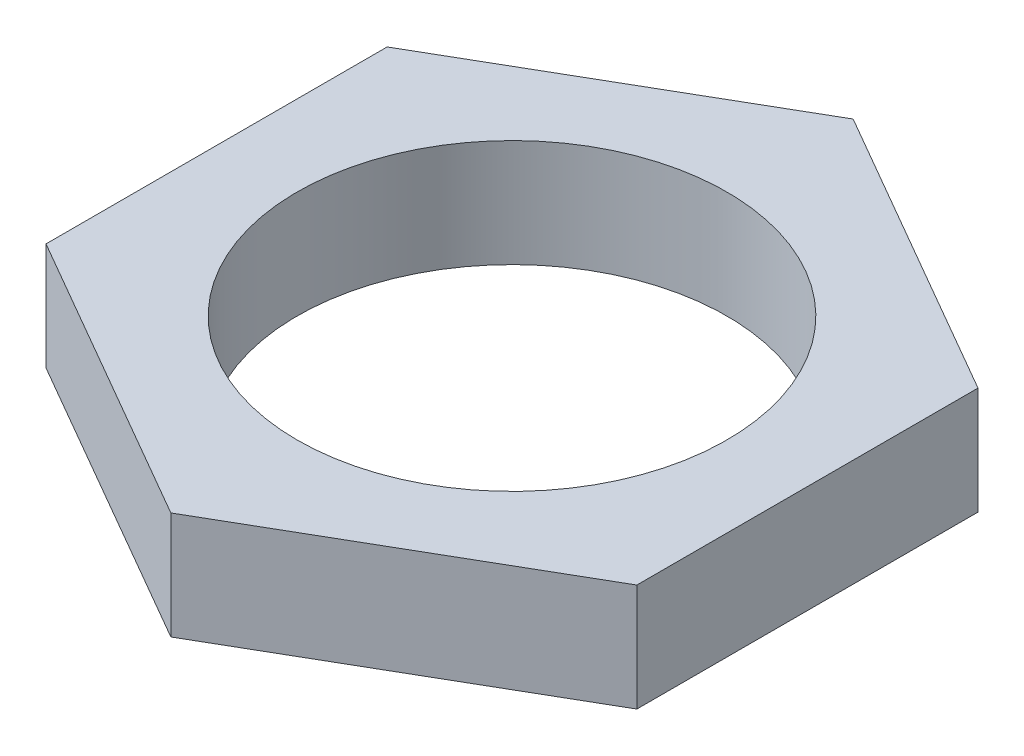
ISO-10303-21;
HEADER;
FILE_DESCRIPTION(('STEP AP214'),'2;1');
FILE_NAME('part.step','',(''),(''),'','','');
FILE_SCHEMA(('AUTOMOTIVE_DESIGN { 1 0 10303 214 1 1 1 1 }'));
ENDSEC;
DATA;
#1=APPLICATION_CONTEXT('core data for automotive mechanical design processes');
#2=APPLICATION_PROTOCOL_DEFINITION('international standard','automotive_design',2000,#1);
#3=PRODUCT_CONTEXT('',#1,'mechanical');
#4=PRODUCT('Part','Part','',(#3));
#5=PRODUCT_RELATED_PRODUCT_CATEGORY('part','',(#4));
#6=PRODUCT_DEFINITION_FORMATION('','',#4);
#7=PRODUCT_DEFINITION_CONTEXT('part definition',#1,'design');
#8=PRODUCT_DEFINITION('design','',#6,#7);
#9=PRODUCT_DEFINITION_SHAPE('','',#8);
#10=(LENGTH_UNIT() NAMED_UNIT(*) SI_UNIT(.MILLI.,.METRE.));
#11=(NAMED_UNIT(*) PLANE_ANGLE_UNIT() SI_UNIT($,.RADIAN.));
#12=(NAMED_UNIT(*) SI_UNIT($,.STERADIAN.) SOLID_ANGLE_UNIT());
#13=UNCERTAINTY_MEASURE_WITH_UNIT(LENGTH_MEASURE(1.E-05),#10,'distance_accuracy_value','');
#14=(GEOMETRIC_REPRESENTATION_CONTEXT(3) GLOBAL_UNCERTAINTY_ASSIGNED_CONTEXT((#13)) GLOBAL_UNIT_ASSIGNED_CONTEXT((#10,
#11,#12)) REPRESENTATION_CONTEXT('',''));
#15=CARTESIAN_POINT('',(0.,0.,0.));
#16=DIRECTION('',(0.,0.,1.));
#17=DIRECTION('',(1.,0.,0.));
#18=AXIS2_PLACEMENT_3D('',#15,#16,#17);
#19=CARTESIAN_POINT('',(0.,2.,0.));
#20=DIRECTION('',(0.,1.,0.));
#21=DIRECTION('',(0.,0.,1.));
#22=AXIS2_PLACEMENT_3D('',#19,#20,#21);
#23=PLANE('',#22);
#24=DIRECTION('',(-0.866025403784439,0.,-0.5));
#25=VECTOR('',#24,1.);
#26=CARTESIAN_POINT('',(5.5,2.,-3.17542648054294));
#27=LINE('',#26,#25);
#28=CARTESIAN_POINT('',(5.5,2.,-3.17542648054294));
#29=VERTEX_POINT('',#28);
#30=CARTESIAN_POINT('',(0.,2.,-6.35085296108588));
#31=VERTEX_POINT('',#30);
#32=EDGE_CURVE('E131',#29,#31,#27,.T.);
#33=ORIENTED_EDGE('',*,*,#32,.T.);
#34=DIRECTION('',(-0.866025403784439,0.,0.5));
#35=VECTOR('',#34,1.);
#36=CARTESIAN_POINT('',(0.,2.,-6.35085296108588));
#37=LINE('',#36,#35);
#38=CARTESIAN_POINT('',(-5.5,2.,-3.17542648054294));
#39=VERTEX_POINT('',#38);
#40=EDGE_CURVE('E89',#31,#39,#37,.T.);
#41=ORIENTED_EDGE('',*,*,#40,.T.);
#42=DIRECTION('',(0.,0.,1.));
#43=VECTOR('',#42,1.);
#44=CARTESIAN_POINT('',(-5.5,2.,-3.17542648054294));
#45=LINE('',#44,#43);
#46=CARTESIAN_POINT('',(-5.5,2.,3.17542648054294));
#47=VERTEX_POINT('',#46);
#48=EDGE_CURVE('E102',#39,#47,#45,.T.);
#49=ORIENTED_EDGE('',*,*,#48,.T.);
#50=DIRECTION('',(0.866025403784439,0.,0.5));
#51=VECTOR('',#50,1.);
#52=CARTESIAN_POINT('',(-5.5,2.,3.17542648054294));
#53=LINE('',#52,#51);
#54=CARTESIAN_POINT('',(0.,2.,6.35085296108589));
#55=VERTEX_POINT('',#54);
#56=EDGE_CURVE('E96',#47,#55,#53,.T.);
#57=ORIENTED_EDGE('',*,*,#56,.T.);
#58=DIRECTION('',(0.866025403784439,0.,-0.5));
#59=VECTOR('',#58,1.);
#60=CARTESIAN_POINT('',(0.,2.,6.35085296108589));
#61=LINE('',#60,#59);
#62=CARTESIAN_POINT('',(5.5,2.,3.17542648054295));
#63=VERTEX_POINT('',#62);
#64=EDGE_CURVE('E100',#55,#63,#61,.T.);
#65=ORIENTED_EDGE('',*,*,#64,.T.);
#66=DIRECTION('',(0.,0.,-1.));
#67=VECTOR('',#66,1.);
#68=CARTESIAN_POINT('',(5.5,2.,3.17542648054295));
#69=LINE('',#68,#67);
#70=EDGE_CURVE('E52',#63,#29,#69,.T.);
#71=ORIENTED_EDGE('',*,*,#70,.T.);
#72=EDGE_LOOP('',(#33,#41,#49,#57,#65,#71));
#73=FACE_BOUND('',#72,.T.);
#74=CARTESIAN_POINT('',(0.,2.,0.));
#75=DIRECTION('',(0.,1.,0.));
#76=DIRECTION('',(0.,0.,1.));
#77=AXIS2_PLACEMENT_3D('',#74,#75,#76);
#78=CIRCLE('',#77,4.);
#79=CARTESIAN_POINT('',(0.,2.,4.));
#80=VERTEX_POINT('',#79);
#81=EDGE_CURVE('E124',#80,#80,#78,.T.);
#82=ORIENTED_EDGE('',*,*,#81,.F.);
#83=EDGE_LOOP('',(#82));
#84=FACE_BOUND('',#83,.T.);
#85=ADVANCED_FACE('F35',(#73,#84),#23,.T.);
#86=CARTESIAN_POINT('',(0.,0.,0.));
#87=DIRECTION('',(0.,1.,0.));
#88=DIRECTION('',(0.,0.,1.));
#89=AXIS2_PLACEMENT_3D('',#86,#87,#88);
#90=PLANE('',#89);
#91=DIRECTION('',(-0.866025403784439,0.,-0.5));
#92=VECTOR('',#91,1.);
#93=CARTESIAN_POINT('',(5.5,0.,-3.17542648054294));
#94=LINE('',#93,#92);
#95=CARTESIAN_POINT('',(5.5,0.,-3.17542648054294));
#96=VERTEX_POINT('',#95);
#97=CARTESIAN_POINT('',(0.,0.,-6.35085296108588));
#98=VERTEX_POINT('',#97);
#99=EDGE_CURVE('E120',#96,#98,#94,.T.);
#100=ORIENTED_EDGE('',*,*,#99,.F.);
#101=DIRECTION('',(0.,0.,-1.));
#102=VECTOR('',#101,1.);
#103=CARTESIAN_POINT('',(5.5,0.,3.17542648054295));
#104=LINE('',#103,#102);
#105=CARTESIAN_POINT('',(5.5,0.,3.17542648054295));
#106=VERTEX_POINT('',#105);
#107=EDGE_CURVE('E81',#106,#96,#104,.T.);
#108=ORIENTED_EDGE('',*,*,#107,.F.);
#109=DIRECTION('',(0.866025403784439,0.,-0.5));
#110=VECTOR('',#109,1.);
#111=CARTESIAN_POINT('',(0.,0.,6.35085296108589));
#112=LINE('',#111,#110);
#113=CARTESIAN_POINT('',(0.,0.,6.35085296108589));
#114=VERTEX_POINT('',#113);
#115=EDGE_CURVE('E75',#114,#106,#112,.T.);
#116=ORIENTED_EDGE('',*,*,#115,.F.);
#117=DIRECTION('',(0.866025403784439,0.,0.5));
#118=VECTOR('',#117,1.);
#119=CARTESIAN_POINT('',(-5.5,0.,3.17542648054294));
#120=LINE('',#119,#118);
#121=CARTESIAN_POINT('',(-5.5,0.,3.17542648054294));
#122=VERTEX_POINT('',#121);
#123=EDGE_CURVE('E110',#122,#114,#120,.T.);
#124=ORIENTED_EDGE('',*,*,#123,.F.);
#125=DIRECTION('',(0.,0.,1.));
#126=VECTOR('',#125,1.);
#127=CARTESIAN_POINT('',(-5.5,0.,-3.17542648054294));
#128=LINE('',#127,#126);
#129=CARTESIAN_POINT('',(-5.5,0.,-3.17542648054294));
#130=VERTEX_POINT('',#129);
#131=EDGE_CURVE('E126',#130,#122,#128,.T.);
#132=ORIENTED_EDGE('',*,*,#131,.F.);
#133=DIRECTION('',(-0.866025403784439,0.,0.5));
#134=VECTOR('',#133,1.);
#135=CARTESIAN_POINT('',(0.,0.,-6.35085296108588));
#136=LINE('',#135,#134);
#137=EDGE_CURVE('E123',#98,#130,#136,.T.);
#138=ORIENTED_EDGE('',*,*,#137,.F.);
#139=EDGE_LOOP('',(#100,#108,#116,#124,#132,#138));
#140=FACE_BOUND('',#139,.T.);
#141=CARTESIAN_POINT('',(0.,0.,0.));
#142=DIRECTION('',(0.,1.,0.));
#143=DIRECTION('',(0.,0.,1.));
#144=AXIS2_PLACEMENT_3D('',#141,#142,#143);
#145=CIRCLE('',#144,4.);
#146=CARTESIAN_POINT('',(0.,0.,4.));
#147=VERTEX_POINT('',#146);
#148=EDGE_CURVE('E224',#147,#147,#145,.T.);
#149=ORIENTED_EDGE('',*,*,#148,.T.);
#150=EDGE_LOOP('',(#149));
#151=FACE_BOUND('',#150,.T.);
#152=ADVANCED_FACE('F140',(#140,#151),#90,.F.);
#153=CARTESIAN_POINT('',(5.5,2.,-3.17542648054294));
#154=DIRECTION('',(-0.5,0.,0.866025403784439));
#155=DIRECTION('',(0.866025403784439,0.,0.5));
#156=AXIS2_PLACEMENT_3D('',#153,#154,#155);
#157=PLANE('',#156);
#158=ORIENTED_EDGE('',*,*,#99,.T.);
#159=DIRECTION('',(0.,-1.,0.));
#160=VECTOR('',#159,1.);
#161=CARTESIAN_POINT('',(0.,2.,-6.35085296108588));
#162=LINE('',#161,#160);
#163=EDGE_CURVE('E11',#31,#98,#162,.T.);
#164=ORIENTED_EDGE('',*,*,#163,.F.);
#165=ORIENTED_EDGE('',*,*,#32,.F.);
#166=DIRECTION('',(0.,-1.,0.));
#167=VECTOR('',#166,1.);
#168=CARTESIAN_POINT('',(5.5,2.,-3.17542648054294));
#169=LINE('',#168,#167);
#170=EDGE_CURVE('E116',#29,#96,#169,.T.);
#171=ORIENTED_EDGE('',*,*,#170,.T.);
#172=EDGE_LOOP('',(#158,#164,#165,#171));
#173=FACE_BOUND('',#172,.T.);
#174=ADVANCED_FACE('F37',(#173),#157,.F.);
#175=CARTESIAN_POINT('',(0.,2.,-6.35085296108588));
#176=DIRECTION('',(0.5,0.,0.866025403784439));
#177=DIRECTION('',(0.866025403784439,0.,-0.5));
#178=AXIS2_PLACEMENT_3D('',#175,#176,#177);
#179=PLANE('',#178);
#180=ORIENTED_EDGE('',*,*,#137,.T.);
#181=DIRECTION('',(0.,-1.,0.));
#182=VECTOR('',#181,1.);
#183=CARTESIAN_POINT('',(-5.5,2.,-3.17542648054294));
#184=LINE('',#183,#182);
#185=EDGE_CURVE('E44',#39,#130,#184,.T.);
#186=ORIENTED_EDGE('',*,*,#185,.F.);
#187=ORIENTED_EDGE('',*,*,#40,.F.);
#188=ORIENTED_EDGE('',*,*,#163,.T.);
#189=EDGE_LOOP('',(#180,#186,#187,#188));
#190=FACE_BOUND('',#189,.T.);
#191=ADVANCED_FACE('F165',(#190),#179,.F.);
#192=CARTESIAN_POINT('',(-5.5,2.,-3.17542648054294));
#193=DIRECTION('',(1.,0.,0.));
#194=DIRECTION('',(0.,0.,-1.));
#195=AXIS2_PLACEMENT_3D('',#192,#193,#194);
#196=PLANE('',#195);
#197=ORIENTED_EDGE('',*,*,#131,.T.);
#198=DIRECTION('',(0.,-1.,0.));
#199=VECTOR('',#198,1.);
#200=CARTESIAN_POINT('',(-5.5,2.,3.17542648054294));
#201=LINE('',#200,#199);
#202=EDGE_CURVE('E111',#47,#122,#201,.T.);
#203=ORIENTED_EDGE('',*,*,#202,.F.);
#204=ORIENTED_EDGE('',*,*,#48,.F.);
#205=ORIENTED_EDGE('',*,*,#185,.T.);
#206=EDGE_LOOP('',(#197,#203,#204,#205));
#207=FACE_BOUND('',#206,.T.);
#208=ADVANCED_FACE('F137',(#207),#196,.F.);
#209=CARTESIAN_POINT('',(-5.5,2.,3.17542648054294));
#210=DIRECTION('',(0.5,0.,-0.866025403784439));
#211=DIRECTION('',(-0.866025403784439,0.,-0.5));
#212=AXIS2_PLACEMENT_3D('',#209,#210,#211);
#213=PLANE('',#212);
#214=ORIENTED_EDGE('',*,*,#123,.T.);
#215=DIRECTION('',(0.,-1.,0.));
#216=VECTOR('',#215,1.);
#217=CARTESIAN_POINT('',(0.,2.,6.35085296108589));
#218=LINE('',#217,#216);
#219=EDGE_CURVE('E107',#55,#114,#218,.T.);
#220=ORIENTED_EDGE('',*,*,#219,.F.);
#221=ORIENTED_EDGE('',*,*,#56,.F.);
#222=ORIENTED_EDGE('',*,*,#202,.T.);
#223=EDGE_LOOP('',(#214,#220,#221,#222));
#224=FACE_BOUND('',#223,.T.);
#225=ADVANCED_FACE('F108',(#224),#213,.F.);
#226=CARTESIAN_POINT('',(0.,2.,6.35085296108589));
#227=DIRECTION('',(-0.5,0.,-0.866025403784439));
#228=DIRECTION('',(-0.866025403784439,0.,0.5));
#229=AXIS2_PLACEMENT_3D('',#226,#227,#228);
#230=PLANE('',#229);
#231=ORIENTED_EDGE('',*,*,#115,.T.);
#232=DIRECTION('',(0.,-1.,0.));
#233=VECTOR('',#232,1.);
#234=CARTESIAN_POINT('',(5.5,2.,3.17542648054295));
#235=LINE('',#234,#233);
#236=EDGE_CURVE('E112',#63,#106,#235,.T.);
#237=ORIENTED_EDGE('',*,*,#236,.F.);
#238=ORIENTED_EDGE('',*,*,#64,.F.);
#239=ORIENTED_EDGE('',*,*,#219,.T.);
#240=EDGE_LOOP('',(#231,#237,#238,#239));
#241=FACE_BOUND('',#240,.T.);
#242=ADVANCED_FACE('F114',(#241),#230,.F.);
#243=CARTESIAN_POINT('',(5.5,2.,3.17542648054295));
#244=DIRECTION('',(-1.,0.,0.));
#245=DIRECTION('',(0.,0.,1.));
#246=AXIS2_PLACEMENT_3D('',#243,#244,#245);
#247=PLANE('',#246);
#248=ORIENTED_EDGE('',*,*,#107,.T.);
#249=ORIENTED_EDGE('',*,*,#170,.F.);
#250=ORIENTED_EDGE('',*,*,#70,.F.);
#251=ORIENTED_EDGE('',*,*,#236,.T.);
#252=EDGE_LOOP('',(#248,#249,#250,#251));
#253=FACE_BOUND('',#252,.T.);
#254=ADVANCED_FACE('F145',(#253),#247,.F.);
#255=CARTESIAN_POINT('',(0.,2.,0.));
#256=DIRECTION('',(0.,-1.,0.));
#257=DIRECTION('',(0.,0.,-1.));
#258=AXIS2_PLACEMENT_3D('',#255,#256,#257);
#259=CYLINDRICAL_SURFACE('',#258,4.);
#260=ORIENTED_EDGE('',*,*,#81,.T.);
#261=EDGE_LOOP('',(#260));
#262=FACE_BOUND('',#261,.T.);
#263=ORIENTED_EDGE('',*,*,#148,.F.);
#264=EDGE_LOOP('',(#263));
#265=FACE_BOUND('',#264,.T.);
#266=ADVANCED_FACE('F147',(#262,#265),#259,.F.);
#267=CLOSED_SHELL('',(#85,#152,#174,#191,#208,#225,#242,#254,#266));
#268=MANIFOLD_SOLID_BREP('B2',#267);
#269=ADVANCED_BREP_SHAPE_REPRESENTATION('',(#18,#268),#14);
#270=SHAPE_DEFINITION_REPRESENTATION(#9,#269);
ENDSEC;
END-ISO-10303-21;
